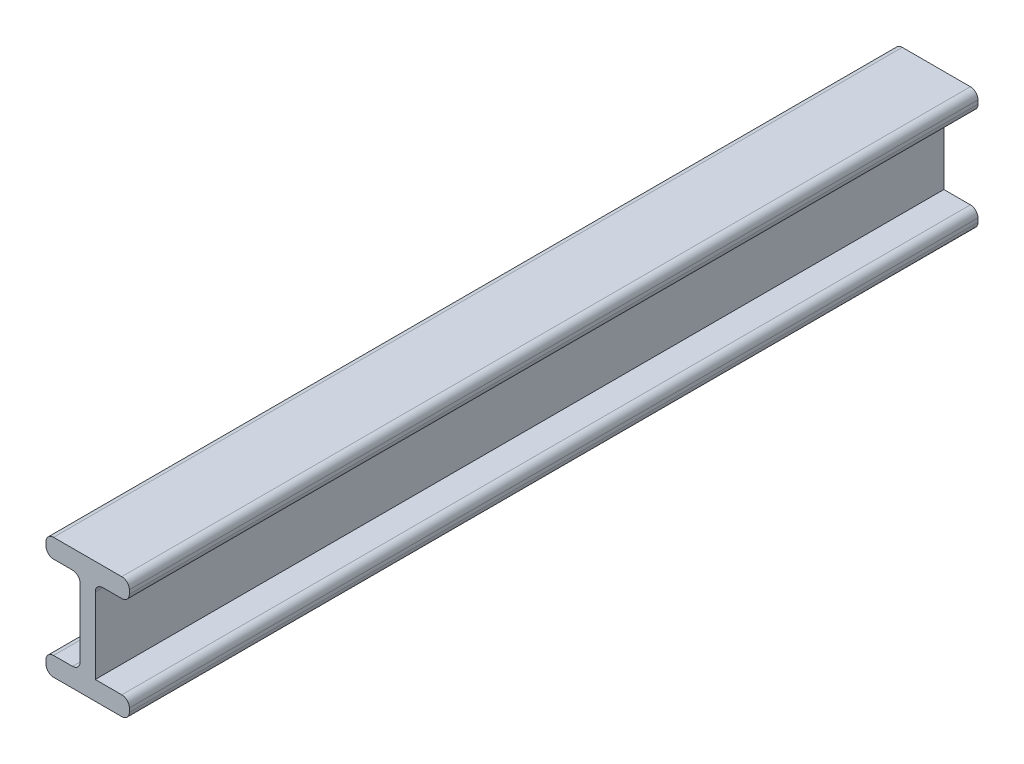
ISO-10303-21;
HEADER;
FILE_DESCRIPTION(('STEP AP214'),'2;1');
FILE_NAME('part.step','',(''),(''),'','','');
FILE_SCHEMA(('AUTOMOTIVE_DESIGN { 1 0 10303 214 1 1 1 1 }'));
ENDSEC;
DATA;
#1=APPLICATION_CONTEXT('core data for automotive mechanical design processes');
#2=APPLICATION_PROTOCOL_DEFINITION('international standard','automotive_design',2000,#1);
#3=PRODUCT_CONTEXT('',#1,'mechanical');
#4=PRODUCT('Part','Part','',(#3));
#5=PRODUCT_RELATED_PRODUCT_CATEGORY('part','',(#4));
#6=PRODUCT_DEFINITION_FORMATION('','',#4);
#7=PRODUCT_DEFINITION_CONTEXT('part definition',#1,'design');
#8=PRODUCT_DEFINITION('design','',#6,#7);
#9=PRODUCT_DEFINITION_SHAPE('','',#8);
#10=(LENGTH_UNIT() NAMED_UNIT(*) SI_UNIT(.MILLI.,.METRE.));
#11=(NAMED_UNIT(*) PLANE_ANGLE_UNIT() SI_UNIT($,.RADIAN.));
#12=(NAMED_UNIT(*) SI_UNIT($,.STERADIAN.) SOLID_ANGLE_UNIT());
#13=UNCERTAINTY_MEASURE_WITH_UNIT(LENGTH_MEASURE(1.E-05),#10,'distance_accuracy_value','');
#14=(GEOMETRIC_REPRESENTATION_CONTEXT(3) GLOBAL_UNCERTAINTY_ASSIGNED_CONTEXT((#13)) GLOBAL_UNIT_ASSIGNED_CONTEXT((#10,
#11,#12)) REPRESENTATION_CONTEXT('',''));
#15=CARTESIAN_POINT('',(0.,0.,0.));
#16=DIRECTION('',(0.,0.,1.));
#17=DIRECTION('',(1.,0.,0.));
#18=AXIS2_PLACEMENT_3D('',#15,#16,#17);
#19=CARTESIAN_POINT('',(20.,45.,1120.));
#20=DIRECTION('',(0.,0.,-1.));
#21=DIRECTION('',(-1.,0.,0.));
#22=AXIS2_PLACEMENT_3D('',#19,#20,#21);
#23=CYLINDRICAL_SURFACE('',#22,10.);
#24=CARTESIAN_POINT('',(20.,45.,0.));
#25=DIRECTION('',(0.,0.,-1.));
#26=DIRECTION('',(1.,0.,0.));
#27=AXIS2_PLACEMENT_3D('',#24,#25,#26);
#28=CIRCLE('',#27,10.);
#29=CARTESIAN_POINT('',(10.,45.,0.));
#30=VERTEX_POINT('',#29);
#31=CARTESIAN_POINT('',(20.,55.,0.));
#32=VERTEX_POINT('',#31);
#33=EDGE_CURVE('E242',#30,#32,#28,.T.);
#34=ORIENTED_EDGE('',*,*,#33,.T.);
#35=DIRECTION('',(0.,0.,-1.));
#36=VECTOR('',#35,1.);
#37=CARTESIAN_POINT('',(20.,55.,1120.));
#38=LINE('',#37,#36);
#39=CARTESIAN_POINT('',(20.,55.,1120.));
#40=VERTEX_POINT('',#39);
#41=EDGE_CURVE('E12',#40,#32,#38,.T.);
#42=ORIENTED_EDGE('',*,*,#41,.F.);
#43=CARTESIAN_POINT('',(20.,45.,1120.));
#44=DIRECTION('',(0.,0.,-1.));
#45=DIRECTION('',(1.,0.,0.));
#46=AXIS2_PLACEMENT_3D('',#43,#44,#45);
#47=CIRCLE('',#46,10.);
#48=CARTESIAN_POINT('',(10.,45.,1120.));
#49=VERTEX_POINT('',#48);
#50=EDGE_CURVE('E353',#49,#40,#47,.T.);
#51=ORIENTED_EDGE('',*,*,#50,.F.);
#52=DIRECTION('',(0.,0.,-1.));
#53=VECTOR('',#52,1.);
#54=CARTESIAN_POINT('',(10.,45.,1120.));
#55=LINE('',#54,#53);
#56=EDGE_CURVE('E237',#49,#30,#55,.T.);
#57=ORIENTED_EDGE('',*,*,#56,.T.);
#58=EDGE_LOOP('',(#34,#42,#51,#57));
#59=FACE_BOUND('',#58,.T.);
#60=ADVANCED_FACE('F50',(#59),#23,.F.);
#61=CARTESIAN_POINT('',(20.,55.,1120.));
#62=DIRECTION('',(0.,1.,0.));
#63=DIRECTION('',(-1.,0.,0.));
#64=AXIS2_PLACEMENT_3D('',#61,#62,#63);
#65=PLANE('',#64);
#66=DIRECTION('',(1.,0.,0.));
#67=VECTOR('',#66,1.);
#68=CARTESIAN_POINT('',(20.,55.,0.));
#69=LINE('',#68,#67);
#70=CARTESIAN_POINT('',(45.,55.,0.));
#71=VERTEX_POINT('',#70);
#72=EDGE_CURVE('E293',#32,#71,#69,.T.);
#73=ORIENTED_EDGE('',*,*,#72,.T.);
#74=DIRECTION('',(0.,0.,-1.));
#75=VECTOR('',#74,1.);
#76=CARTESIAN_POINT('',(45.,55.,1120.));
#77=LINE('',#76,#75);
#78=CARTESIAN_POINT('',(45.,55.,1120.));
#79=VERTEX_POINT('',#78);
#80=EDGE_CURVE('E59',#79,#71,#77,.T.);
#81=ORIENTED_EDGE('',*,*,#80,.F.);
#82=DIRECTION('',(1.,0.,0.));
#83=VECTOR('',#82,1.);
#84=CARTESIAN_POINT('',(20.,55.,1120.));
#85=LINE('',#84,#83);
#86=EDGE_CURVE('E155',#40,#79,#85,.T.);
#87=ORIENTED_EDGE('',*,*,#86,.F.);
#88=ORIENTED_EDGE('',*,*,#41,.T.);
#89=EDGE_LOOP('',(#73,#81,#87,#88));
#90=FACE_BOUND('',#89,.T.);
#91=ADVANCED_FACE('F515',(#90),#65,.F.);
#92=CARTESIAN_POINT('',(45.,65.,1120.));
#93=DIRECTION('',(0.,0.,-1.));
#94=DIRECTION('',(-1.,0.,0.));
#95=AXIS2_PLACEMENT_3D('',#92,#93,#94);
#96=CYLINDRICAL_SURFACE('',#95,10.);
#97=CARTESIAN_POINT('',(45.,65.,0.));
#98=DIRECTION('',(0.,0.,1.));
#99=DIRECTION('',(1.,0.,0.));
#100=AXIS2_PLACEMENT_3D('',#97,#98,#99);
#101=CIRCLE('',#100,10.);
#102=CARTESIAN_POINT('',(55.,65.,0.));
#103=VERTEX_POINT('',#102);
#104=EDGE_CURVE('E287',#71,#103,#101,.T.);
#105=ORIENTED_EDGE('',*,*,#104,.T.);
#106=DIRECTION('',(0.,0.,-1.));
#107=VECTOR('',#106,1.);
#108=CARTESIAN_POINT('',(55.,65.,1120.));
#109=LINE('',#108,#107);
#110=CARTESIAN_POINT('',(55.,65.,1120.));
#111=VERTEX_POINT('',#110);
#112=EDGE_CURVE('E276',#111,#103,#109,.T.);
#113=ORIENTED_EDGE('',*,*,#112,.F.);
#114=CARTESIAN_POINT('',(45.,65.,1120.));
#115=DIRECTION('',(0.,0.,1.));
#116=DIRECTION('',(1.,0.,0.));
#117=AXIS2_PLACEMENT_3D('',#114,#115,#116);
#118=CIRCLE('',#117,10.);
#119=EDGE_CURVE('E288',#79,#111,#118,.T.);
#120=ORIENTED_EDGE('',*,*,#119,.F.);
#121=ORIENTED_EDGE('',*,*,#80,.T.);
#122=EDGE_LOOP('',(#105,#113,#120,#121));
#123=FACE_BOUND('',#122,.T.);
#124=ADVANCED_FACE('F285',(#123),#96,.T.);
#125=CARTESIAN_POINT('',(55.,69.9999999999999,1120.));
#126=DIRECTION('',(-1.,0.,0.));
#127=DIRECTION('',(0.,-1.,0.));
#128=AXIS2_PLACEMENT_3D('',#125,#126,#127);
#129=PLANE('',#128);
#130=DIRECTION('',(0.,1.,0.));
#131=VECTOR('',#130,1.);
#132=CARTESIAN_POINT('',(55.,69.9999999999999,0.));
#133=LINE('',#132,#131);
#134=CARTESIAN_POINT('',(55.,69.9999999999999,0.));
#135=VERTEX_POINT('',#134);
#136=EDGE_CURVE('E295',#103,#135,#133,.T.);
#137=ORIENTED_EDGE('',*,*,#136,.T.);
#138=DIRECTION('',(0.,0.,-1.));
#139=VECTOR('',#138,1.);
#140=CARTESIAN_POINT('',(55.,69.9999999999999,1120.));
#141=LINE('',#140,#139);
#142=CARTESIAN_POINT('',(55.,69.9999999999999,1120.));
#143=VERTEX_POINT('',#142);
#144=EDGE_CURVE('E269',#143,#135,#141,.T.);
#145=ORIENTED_EDGE('',*,*,#144,.F.);
#146=DIRECTION('',(0.,1.,0.));
#147=VECTOR('',#146,1.);
#148=CARTESIAN_POINT('',(55.,69.9999999999999,1120.));
#149=LINE('',#148,#147);
#150=EDGE_CURVE('E363',#111,#143,#149,.T.);
#151=ORIENTED_EDGE('',*,*,#150,.F.);
#152=ORIENTED_EDGE('',*,*,#112,.T.);
#153=EDGE_LOOP('',(#137,#145,#151,#152));
#154=FACE_BOUND('',#153,.T.);
#155=ADVANCED_FACE('F507',(#154),#129,.F.);
#156=CARTESIAN_POINT('',(45.,69.9999999999999,1120.));
#157=DIRECTION('',(0.,0.,-1.));
#158=DIRECTION('',(-1.,0.,0.));
#159=AXIS2_PLACEMENT_3D('',#156,#157,#158);
#160=CYLINDRICAL_SURFACE('',#159,10.0000000000001);
#161=CARTESIAN_POINT('',(45.,69.9999999999999,0.));
#162=DIRECTION('',(0.,0.,1.));
#163=DIRECTION('',(-1.,0.,0.));
#164=AXIS2_PLACEMENT_3D('',#161,#162,#163);
#165=CIRCLE('',#164,10.0000000000001);
#166=CARTESIAN_POINT('',(45.,80.,0.));
#167=VERTEX_POINT('',#166);
#168=EDGE_CURVE('E300',#135,#167,#165,.T.);
#169=ORIENTED_EDGE('',*,*,#168,.T.);
#170=DIRECTION('',(0.,0.,-1.));
#171=VECTOR('',#170,1.);
#172=CARTESIAN_POINT('',(45.,80.,1120.));
#173=LINE('',#172,#171);
#174=CARTESIAN_POINT('',(45.,80.,1120.));
#175=VERTEX_POINT('',#174);
#176=EDGE_CURVE('E264',#175,#167,#173,.T.);
#177=ORIENTED_EDGE('',*,*,#176,.F.);
#178=CARTESIAN_POINT('',(45.,69.9999999999999,1120.));
#179=DIRECTION('',(0.,0.,1.));
#180=DIRECTION('',(-1.,0.,0.));
#181=AXIS2_PLACEMENT_3D('',#178,#179,#180);
#182=CIRCLE('',#181,10.0000000000001);
#183=EDGE_CURVE('E366',#143,#175,#182,.T.);
#184=ORIENTED_EDGE('',*,*,#183,.F.);
#185=ORIENTED_EDGE('',*,*,#144,.T.);
#186=EDGE_LOOP('',(#169,#177,#184,#185));
#187=FACE_BOUND('',#186,.T.);
#188=ADVANCED_FACE('F503',(#187),#160,.T.);
#189=CARTESIAN_POINT('',(-45.,80.0000000000001,1120.));
#190=DIRECTION('',(0.,-1.,0.));
#191=DIRECTION('',(0.,0.,-1.));
#192=AXIS2_PLACEMENT_3D('',#189,#190,#191);
#193=PLANE('',#192);
#194=DIRECTION('',(-1.,0.,0.));
#195=VECTOR('',#194,1.);
#196=CARTESIAN_POINT('',(-45.,80.0000000000001,0.));
#197=LINE('',#196,#195);
#198=CARTESIAN_POINT('',(-45.,80.0000000000001,0.));
#199=VERTEX_POINT('',#198);
#200=EDGE_CURVE('E305',#167,#199,#197,.T.);
#201=ORIENTED_EDGE('',*,*,#200,.T.);
#202=DIRECTION('',(0.,0.,-1.));
#203=VECTOR('',#202,1.);
#204=CARTESIAN_POINT('',(-45.,80.0000000000001,1120.));
#205=LINE('',#204,#203);
#206=CARTESIAN_POINT('',(-45.,80.0000000000001,1120.));
#207=VERTEX_POINT('',#206);
#208=EDGE_CURVE('E270',#207,#199,#205,.T.);
#209=ORIENTED_EDGE('',*,*,#208,.F.);
#210=DIRECTION('',(-1.,0.,0.));
#211=VECTOR('',#210,1.);
#212=CARTESIAN_POINT('',(-45.,80.0000000000001,1120.));
#213=LINE('',#212,#211);
#214=EDGE_CURVE('E369',#175,#207,#213,.T.);
#215=ORIENTED_EDGE('',*,*,#214,.F.);
#216=ORIENTED_EDGE('',*,*,#176,.T.);
#217=EDGE_LOOP('',(#201,#209,#215,#216));
#218=FACE_BOUND('',#217,.T.);
#219=ADVANCED_FACE('F501',(#218),#193,.F.);
#220=CARTESIAN_POINT('',(-45.,70.,1120.));
#221=DIRECTION('',(0.,0.,-1.));
#222=DIRECTION('',(-1.,0.,0.));
#223=AXIS2_PLACEMENT_3D('',#220,#221,#222);
#224=CYLINDRICAL_SURFACE('',#223,10.);
#225=CARTESIAN_POINT('',(-45.,70.,0.));
#226=DIRECTION('',(0.,0.,1.));
#227=DIRECTION('',(-1.,0.,0.));
#228=AXIS2_PLACEMENT_3D('',#225,#226,#227);
#229=CIRCLE('',#228,10.);
#230=CARTESIAN_POINT('',(-55.,70.,0.));
#231=VERTEX_POINT('',#230);
#232=EDGE_CURVE('E308',#199,#231,#229,.T.);
#233=ORIENTED_EDGE('',*,*,#232,.T.);
#234=DIRECTION('',(0.,0.,-1.));
#235=VECTOR('',#234,1.);
#236=CARTESIAN_POINT('',(-55.,70.,1120.));
#237=LINE('',#236,#235);
#238=CARTESIAN_POINT('',(-55.,70.,1120.));
#239=VERTEX_POINT('',#238);
#240=EDGE_CURVE('E472',#239,#231,#237,.T.);
#241=ORIENTED_EDGE('',*,*,#240,.F.);
#242=CARTESIAN_POINT('',(-45.,70.,1120.));
#243=DIRECTION('',(0.,0.,1.));
#244=DIRECTION('',(-1.,0.,0.));
#245=AXIS2_PLACEMENT_3D('',#242,#243,#244);
#246=CIRCLE('',#245,10.);
#247=EDGE_CURVE('E372',#207,#239,#246,.T.);
#248=ORIENTED_EDGE('',*,*,#247,.F.);
#249=ORIENTED_EDGE('',*,*,#208,.T.);
#250=EDGE_LOOP('',(#233,#241,#248,#249));
#251=FACE_BOUND('',#250,.T.);
#252=ADVANCED_FACE('F485',(#251),#224,.T.);
#253=CARTESIAN_POINT('',(-55.,70.,1120.));
#254=DIRECTION('',(1.,0.,0.));
#255=DIRECTION('',(0.,0.,-1.));
#256=AXIS2_PLACEMENT_3D('',#253,#254,#255);
#257=PLANE('',#256);
#258=DIRECTION('',(0.,-1.,0.));
#259=VECTOR('',#258,1.);
#260=CARTESIAN_POINT('',(-55.,70.,0.));
#261=LINE('',#260,#259);
#262=CARTESIAN_POINT('',(-55.,65.,0.));
#263=VERTEX_POINT('',#262);
#264=EDGE_CURVE('E311',#231,#263,#261,.T.);
#265=ORIENTED_EDGE('',*,*,#264,.T.);
#266=DIRECTION('',(0.,0.,-1.));
#267=VECTOR('',#266,1.);
#268=CARTESIAN_POINT('',(-55.,65.,1120.));
#269=LINE('',#268,#267);
#270=CARTESIAN_POINT('',(-55.,65.,1120.));
#271=VERTEX_POINT('',#270);
#272=EDGE_CURVE('E469',#271,#263,#269,.T.);
#273=ORIENTED_EDGE('',*,*,#272,.F.);
#274=DIRECTION('',(0.,-1.,0.));
#275=VECTOR('',#274,1.);
#276=CARTESIAN_POINT('',(-55.,70.,1120.));
#277=LINE('',#276,#275);
#278=EDGE_CURVE('E375',#239,#271,#277,.T.);
#279=ORIENTED_EDGE('',*,*,#278,.F.);
#280=ORIENTED_EDGE('',*,*,#240,.T.);
#281=EDGE_LOOP('',(#265,#273,#279,#280));
#282=FACE_BOUND('',#281,.T.);
#283=ADVANCED_FACE('F492',(#282),#257,.F.);
#284=CARTESIAN_POINT('',(-45.,65.,1120.));
#285=DIRECTION('',(0.,0.,-1.));
#286=DIRECTION('',(-1.,0.,0.));
#287=AXIS2_PLACEMENT_3D('',#284,#285,#286);
#288=CYLINDRICAL_SURFACE('',#287,10.);
#289=CARTESIAN_POINT('',(-45.,65.,0.));
#290=DIRECTION('',(0.,0.,1.));
#291=DIRECTION('',(1.,0.,0.));
#292=AXIS2_PLACEMENT_3D('',#289,#290,#291);
#293=CIRCLE('',#292,10.);
#294=CARTESIAN_POINT('',(-45.,55.,0.));
#295=VERTEX_POINT('',#294);
#296=EDGE_CURVE('E314',#263,#295,#293,.T.);
#297=ORIENTED_EDGE('',*,*,#296,.T.);
#298=DIRECTION('',(0.,0.,-1.));
#299=VECTOR('',#298,1.);
#300=CARTESIAN_POINT('',(-45.,55.,1120.));
#301=LINE('',#300,#299);
#302=CARTESIAN_POINT('',(-45.,55.,1120.));
#303=VERTEX_POINT('',#302);
#304=EDGE_CURVE('E465',#303,#295,#301,.T.);
#305=ORIENTED_EDGE('',*,*,#304,.F.);
#306=CARTESIAN_POINT('',(-45.,65.,1120.));
#307=DIRECTION('',(0.,0.,1.));
#308=DIRECTION('',(1.,0.,0.));
#309=AXIS2_PLACEMENT_3D('',#306,#307,#308);
#310=CIRCLE('',#309,10.);
#311=EDGE_CURVE('E378',#271,#303,#310,.T.);
#312=ORIENTED_EDGE('',*,*,#311,.F.);
#313=ORIENTED_EDGE('',*,*,#272,.T.);
#314=EDGE_LOOP('',(#297,#305,#312,#313));
#315=FACE_BOUND('',#314,.T.);
#316=ADVANCED_FACE('F495',(#315),#288,.T.);
#317=CARTESIAN_POINT('',(-45.,55.,1120.));
#318=DIRECTION('',(0.,1.,0.));
#319=DIRECTION('',(-1.,0.,0.));
#320=AXIS2_PLACEMENT_3D('',#317,#318,#319);
#321=PLANE('',#320);
#322=DIRECTION('',(1.,0.,0.));
#323=VECTOR('',#322,1.);
#324=CARTESIAN_POINT('',(-45.,55.,0.));
#325=LINE('',#324,#323);
#326=CARTESIAN_POINT('',(-20.,55.,0.));
#327=VERTEX_POINT('',#326);
#328=EDGE_CURVE('E317',#295,#327,#325,.T.);
#329=ORIENTED_EDGE('',*,*,#328,.T.);
#330=DIRECTION('',(0.,0.,-1.));
#331=VECTOR('',#330,1.);
#332=CARTESIAN_POINT('',(-20.,55.,1120.));
#333=LINE('',#332,#331);
#334=CARTESIAN_POINT('',(-20.,55.,1120.));
#335=VERTEX_POINT('',#334);
#336=EDGE_CURVE('E461',#335,#327,#333,.T.);
#337=ORIENTED_EDGE('',*,*,#336,.F.);
#338=DIRECTION('',(1.,0.,0.));
#339=VECTOR('',#338,1.);
#340=CARTESIAN_POINT('',(-45.,55.,1120.));
#341=LINE('',#340,#339);
#342=EDGE_CURVE('E381',#303,#335,#341,.T.);
#343=ORIENTED_EDGE('',*,*,#342,.F.);
#344=ORIENTED_EDGE('',*,*,#304,.T.);
#345=EDGE_LOOP('',(#329,#337,#343,#344));
#346=FACE_BOUND('',#345,.T.);
#347=ADVANCED_FACE('F563',(#346),#321,.F.);
#348=CARTESIAN_POINT('',(-20.,45.,1120.));
#349=DIRECTION('',(0.,0.,-1.));
#350=DIRECTION('',(-1.,0.,0.));
#351=AXIS2_PLACEMENT_3D('',#348,#349,#350);
#352=CYLINDRICAL_SURFACE('',#351,10.);
#353=CARTESIAN_POINT('',(-20.,45.,0.));
#354=DIRECTION('',(0.,0.,-1.));
#355=DIRECTION('',(1.,0.,0.));
#356=AXIS2_PLACEMENT_3D('',#353,#354,#355);
#357=CIRCLE('',#356,10.);
#358=CARTESIAN_POINT('',(-10.,45.,0.));
#359=VERTEX_POINT('',#358);
#360=EDGE_CURVE('E320',#327,#359,#357,.T.);
#361=ORIENTED_EDGE('',*,*,#360,.T.);
#362=DIRECTION('',(0.,0.,-1.));
#363=VECTOR('',#362,1.);
#364=CARTESIAN_POINT('',(-10.,45.,1120.));
#365=LINE('',#364,#363);
#366=CARTESIAN_POINT('',(-10.,45.,1120.));
#367=VERTEX_POINT('',#366);
#368=EDGE_CURVE('E457',#367,#359,#365,.T.);
#369=ORIENTED_EDGE('',*,*,#368,.F.);
#370=CARTESIAN_POINT('',(-20.,45.,1120.));
#371=DIRECTION('',(0.,0.,-1.));
#372=DIRECTION('',(1.,0.,0.));
#373=AXIS2_PLACEMENT_3D('',#370,#371,#372);
#374=CIRCLE('',#373,10.);
#375=EDGE_CURVE('E384',#335,#367,#374,.T.);
#376=ORIENTED_EDGE('',*,*,#375,.F.);
#377=ORIENTED_EDGE('',*,*,#336,.T.);
#378=EDGE_LOOP('',(#361,#369,#376,#377));
#379=FACE_BOUND('',#378,.T.);
#380=ADVANCED_FACE('F561',(#379),#352,.F.);
#381=CARTESIAN_POINT('',(-10.,45.,1120.));
#382=DIRECTION('',(1.,0.,0.));
#383=DIRECTION('',(0.,0.,-1.));
#384=AXIS2_PLACEMENT_3D('',#381,#382,#383);
#385=PLANE('',#384);
#386=DIRECTION('',(0.,-1.,0.));
#387=VECTOR('',#386,1.);
#388=CARTESIAN_POINT('',(-10.,45.,0.));
#389=LINE('',#388,#387);
#390=CARTESIAN_POINT('',(-10.,-45.,0.));
#391=VERTEX_POINT('',#390);
#392=EDGE_CURVE('E323',#359,#391,#389,.T.);
#393=ORIENTED_EDGE('',*,*,#392,.T.);
#394=DIRECTION('',(0.,0.,-1.));
#395=VECTOR('',#394,1.);
#396=CARTESIAN_POINT('',(-10.,-45.,1120.));
#397=LINE('',#396,#395);
#398=CARTESIAN_POINT('',(-10.,-45.,1120.));
#399=VERTEX_POINT('',#398);
#400=EDGE_CURVE('E453',#399,#391,#397,.T.);
#401=ORIENTED_EDGE('',*,*,#400,.F.);
#402=DIRECTION('',(0.,-1.,0.));
#403=VECTOR('',#402,1.);
#404=CARTESIAN_POINT('',(-10.,45.,1120.));
#405=LINE('',#404,#403);
#406=EDGE_CURVE('E388',#367,#399,#405,.T.);
#407=ORIENTED_EDGE('',*,*,#406,.F.);
#408=ORIENTED_EDGE('',*,*,#368,.T.);
#409=EDGE_LOOP('',(#393,#401,#407,#408));
#410=FACE_BOUND('',#409,.T.);
#411=ADVANCED_FACE('F556',(#410),#385,.F.);
#412=CARTESIAN_POINT('',(-20.,-45.,1120.));
#413=DIRECTION('',(0.,0.,-1.));
#414=DIRECTION('',(-1.,0.,0.));
#415=AXIS2_PLACEMENT_3D('',#412,#413,#414);
#416=CYLINDRICAL_SURFACE('',#415,10.);
#417=CARTESIAN_POINT('',(-20.,-45.,0.));
#418=DIRECTION('',(0.,0.,-1.));
#419=DIRECTION('',(-1.,0.,0.));
#420=AXIS2_PLACEMENT_3D('',#417,#418,#419);
#421=CIRCLE('',#420,10.);
#422=CARTESIAN_POINT('',(-20.,-55.,0.));
#423=VERTEX_POINT('',#422);
#424=EDGE_CURVE('E326',#391,#423,#421,.T.);
#425=ORIENTED_EDGE('',*,*,#424,.T.);
#426=DIRECTION('',(0.,0.,-1.));
#427=VECTOR('',#426,1.);
#428=CARTESIAN_POINT('',(-20.,-55.,1120.));
#429=LINE('',#428,#427);
#430=CARTESIAN_POINT('',(-20.,-55.,1120.));
#431=VERTEX_POINT('',#430);
#432=EDGE_CURVE('E449',#431,#423,#429,.T.);
#433=ORIENTED_EDGE('',*,*,#432,.F.);
#434=CARTESIAN_POINT('',(-20.,-45.,1120.));
#435=DIRECTION('',(0.,0.,-1.));
#436=DIRECTION('',(-1.,0.,0.));
#437=AXIS2_PLACEMENT_3D('',#434,#435,#436);
#438=CIRCLE('',#437,10.);
#439=EDGE_CURVE('E391',#399,#431,#438,.T.);
#440=ORIENTED_EDGE('',*,*,#439,.F.);
#441=ORIENTED_EDGE('',*,*,#400,.T.);
#442=EDGE_LOOP('',(#425,#433,#440,#441));
#443=FACE_BOUND('',#442,.T.);
#444=ADVANCED_FACE('F551',(#443),#416,.F.);
#445=CARTESIAN_POINT('',(-45.,-55.,1120.));
#446=DIRECTION('',(0.,-1.,0.));
#447=DIRECTION('',(1.,0.,0.));
#448=AXIS2_PLACEMENT_3D('',#445,#446,#447);
#449=PLANE('',#448);
#450=DIRECTION('',(-1.,0.,0.));
#451=VECTOR('',#450,1.);
#452=CARTESIAN_POINT('',(-45.,-55.,0.));
#453=LINE('',#452,#451);
#454=CARTESIAN_POINT('',(-45.,-55.,0.));
#455=VERTEX_POINT('',#454);
#456=EDGE_CURVE('E329',#423,#455,#453,.T.);
#457=ORIENTED_EDGE('',*,*,#456,.T.);
#458=DIRECTION('',(0.,0.,-1.));
#459=VECTOR('',#458,1.);
#460=CARTESIAN_POINT('',(-45.,-55.,1120.));
#461=LINE('',#460,#459);
#462=CARTESIAN_POINT('',(-45.,-55.,1120.));
#463=VERTEX_POINT('',#462);
#464=EDGE_CURVE('E445',#463,#455,#461,.T.);
#465=ORIENTED_EDGE('',*,*,#464,.F.);
#466=DIRECTION('',(-1.,0.,0.));
#467=VECTOR('',#466,1.);
#468=CARTESIAN_POINT('',(-45.,-55.,1120.));
#469=LINE('',#468,#467);
#470=EDGE_CURVE('E394',#431,#463,#469,.T.);
#471=ORIENTED_EDGE('',*,*,#470,.F.);
#472=ORIENTED_EDGE('',*,*,#432,.T.);
#473=EDGE_LOOP('',(#457,#465,#471,#472));
#474=FACE_BOUND('',#473,.T.);
#475=ADVANCED_FACE('F547',(#474),#449,.F.);
#476=CARTESIAN_POINT('',(-45.,-65.,1120.));
#477=DIRECTION('',(0.,0.,-1.));
#478=DIRECTION('',(-1.,0.,0.));
#479=AXIS2_PLACEMENT_3D('',#476,#477,#478);
#480=CYLINDRICAL_SURFACE('',#479,10.);
#481=CARTESIAN_POINT('',(-45.,-65.,0.));
#482=DIRECTION('',(0.,0.,1.));
#483=DIRECTION('',(-1.,0.,0.));
#484=AXIS2_PLACEMENT_3D('',#481,#482,#483);
#485=CIRCLE('',#484,10.);
#486=CARTESIAN_POINT('',(-55.,-65.,0.));
#487=VERTEX_POINT('',#486);
#488=EDGE_CURVE('E332',#455,#487,#485,.T.);
#489=ORIENTED_EDGE('',*,*,#488,.T.);
#490=DIRECTION('',(0.,0.,-1.));
#491=VECTOR('',#490,1.);
#492=CARTESIAN_POINT('',(-55.,-65.,1120.));
#493=LINE('',#492,#491);
#494=CARTESIAN_POINT('',(-55.,-65.,1120.));
#495=VERTEX_POINT('',#494);
#496=EDGE_CURVE('E441',#495,#487,#493,.T.);
#497=ORIENTED_EDGE('',*,*,#496,.F.);
#498=CARTESIAN_POINT('',(-45.,-65.,1120.));
#499=DIRECTION('',(0.,0.,1.));
#500=DIRECTION('',(-1.,0.,0.));
#501=AXIS2_PLACEMENT_3D('',#498,#499,#500);
#502=CIRCLE('',#501,10.);
#503=EDGE_CURVE('E397',#463,#495,#502,.T.);
#504=ORIENTED_EDGE('',*,*,#503,.F.);
#505=ORIENTED_EDGE('',*,*,#464,.T.);
#506=EDGE_LOOP('',(#489,#497,#504,#505));
#507=FACE_BOUND('',#506,.T.);
#508=ADVANCED_FACE('F542',(#507),#480,.T.);
#509=CARTESIAN_POINT('',(-55.,-70.,1120.));
#510=DIRECTION('',(1.,0.,0.));
#511=DIRECTION('',(0.,0.,-1.));
#512=AXIS2_PLACEMENT_3D('',#509,#510,#511);
#513=PLANE('',#512);
#514=DIRECTION('',(0.,-1.,0.));
#515=VECTOR('',#514,1.);
#516=CARTESIAN_POINT('',(-55.,-70.,0.));
#517=LINE('',#516,#515);
#518=CARTESIAN_POINT('',(-55.,-70.,0.));
#519=VERTEX_POINT('',#518);
#520=EDGE_CURVE('E335',#487,#519,#517,.T.);
#521=ORIENTED_EDGE('',*,*,#520,.T.);
#522=DIRECTION('',(0.,0.,-1.));
#523=VECTOR('',#522,1.);
#524=CARTESIAN_POINT('',(-55.,-70.,1120.));
#525=LINE('',#524,#523);
#526=CARTESIAN_POINT('',(-55.,-70.,1120.));
#527=VERTEX_POINT('',#526);
#528=EDGE_CURVE('E437',#527,#519,#525,.T.);
#529=ORIENTED_EDGE('',*,*,#528,.F.);
#530=DIRECTION('',(0.,-1.,0.));
#531=VECTOR('',#530,1.);
#532=CARTESIAN_POINT('',(-55.,-70.,1120.));
#533=LINE('',#532,#531);
#534=EDGE_CURVE('E400',#495,#527,#533,.T.);
#535=ORIENTED_EDGE('',*,*,#534,.F.);
#536=ORIENTED_EDGE('',*,*,#496,.T.);
#537=EDGE_LOOP('',(#521,#529,#535,#536));
#538=FACE_BOUND('',#537,.T.);
#539=ADVANCED_FACE('F536',(#538),#513,.F.);
#540=CARTESIAN_POINT('',(-45.,-70.,1120.));
#541=DIRECTION('',(0.,0.,-1.));
#542=DIRECTION('',(-1.,0.,0.));
#543=AXIS2_PLACEMENT_3D('',#540,#541,#542);
#544=CYLINDRICAL_SURFACE('',#543,10.);
#545=CARTESIAN_POINT('',(-45.,-70.,0.));
#546=DIRECTION('',(0.,0.,1.));
#547=DIRECTION('',(1.,0.,0.));
#548=AXIS2_PLACEMENT_3D('',#545,#546,#547);
#549=CIRCLE('',#548,10.);
#550=CARTESIAN_POINT('',(-45.,-80.,0.));
#551=VERTEX_POINT('',#550);
#552=EDGE_CURVE('E338',#519,#551,#549,.T.);
#553=ORIENTED_EDGE('',*,*,#552,.T.);
#554=DIRECTION('',(0.,0.,-1.));
#555=VECTOR('',#554,1.);
#556=CARTESIAN_POINT('',(-45.,-80.,1120.));
#557=LINE('',#556,#555);
#558=CARTESIAN_POINT('',(-45.,-80.,1120.));
#559=VERTEX_POINT('',#558);
#560=EDGE_CURVE('E433',#559,#551,#557,.T.);
#561=ORIENTED_EDGE('',*,*,#560,.F.);
#562=CARTESIAN_POINT('',(-45.,-70.,1120.));
#563=DIRECTION('',(0.,0.,1.));
#564=DIRECTION('',(1.,0.,0.));
#565=AXIS2_PLACEMENT_3D('',#562,#563,#564);
#566=CIRCLE('',#565,10.);
#567=EDGE_CURVE('E403',#527,#559,#566,.T.);
#568=ORIENTED_EDGE('',*,*,#567,.F.);
#569=ORIENTED_EDGE('',*,*,#528,.T.);
#570=EDGE_LOOP('',(#553,#561,#568,#569));
#571=FACE_BOUND('',#570,.T.);
#572=ADVANCED_FACE('F532',(#571),#544,.T.);
#573=CARTESIAN_POINT('',(-45.,-80.0000000000001,1120.));
#574=DIRECTION('',(0.,1.,0.));
#575=DIRECTION('',(0.,0.,1.));
#576=AXIS2_PLACEMENT_3D('',#573,#574,#575);
#577=PLANE('',#576);
#578=DIRECTION('',(1.,0.,0.));
#579=VECTOR('',#578,1.);
#580=CARTESIAN_POINT('',(-45.,-80.0000000000001,0.));
#581=LINE('',#580,#579);
#582=CARTESIAN_POINT('',(45.,-80.0000000000001,0.));
#583=VERTEX_POINT('',#582);
#584=EDGE_CURVE('E341',#551,#583,#581,.T.);
#585=ORIENTED_EDGE('',*,*,#584,.T.);
#586=DIRECTION('',(0.,0.,-1.));
#587=VECTOR('',#586,1.);
#588=CARTESIAN_POINT('',(45.,-80.0000000000001,1120.));
#589=LINE('',#588,#587);
#590=CARTESIAN_POINT('',(45.,-80.0000000000001,1120.));
#591=VERTEX_POINT('',#590);
#592=EDGE_CURVE('E425',#591,#583,#589,.T.);
#593=ORIENTED_EDGE('',*,*,#592,.F.);
#594=DIRECTION('',(1.,0.,0.));
#595=VECTOR('',#594,1.);
#596=CARTESIAN_POINT('',(-45.,-80.0000000000001,1120.));
#597=LINE('',#596,#595);
#598=EDGE_CURVE('E406',#559,#591,#597,.T.);
#599=ORIENTED_EDGE('',*,*,#598,.F.);
#600=ORIENTED_EDGE('',*,*,#560,.T.);
#601=EDGE_LOOP('',(#585,#593,#599,#600));
#602=FACE_BOUND('',#601,.T.);
#603=ADVANCED_FACE('F528',(#602),#577,.F.);
#604=CARTESIAN_POINT('',(45.,-69.9999999999999,1120.));
#605=DIRECTION('',(0.,0.,-1.));
#606=DIRECTION('',(-1.,0.,0.));
#607=AXIS2_PLACEMENT_3D('',#604,#605,#606);
#608=CYLINDRICAL_SURFACE('',#607,10.0000000000001);
#609=CARTESIAN_POINT('',(45.,-69.9999999999999,0.));
#610=DIRECTION('',(0.,0.,1.));
#611=DIRECTION('',(-1.,0.,0.));
#612=AXIS2_PLACEMENT_3D('',#609,#610,#611);
#613=CIRCLE('',#612,10.0000000000001);
#614=CARTESIAN_POINT('',(55.0000000000001,-69.9999999999999,0.));
#615=VERTEX_POINT('',#614);
#616=EDGE_CURVE('E344',#583,#615,#613,.T.);
#617=ORIENTED_EDGE('',*,*,#616,.T.);
#618=DIRECTION('',(0.,0.,-1.));
#619=VECTOR('',#618,1.);
#620=CARTESIAN_POINT('',(55.0000000000001,-69.9999999999999,1120.));
#621=LINE('',#620,#619);
#622=CARTESIAN_POINT('',(55.0000000000001,-69.9999999999999,1120.));
#623=VERTEX_POINT('',#622);
#624=EDGE_CURVE('E419',#623,#615,#621,.T.);
#625=ORIENTED_EDGE('',*,*,#624,.F.);
#626=CARTESIAN_POINT('',(45.,-69.9999999999999,1120.));
#627=DIRECTION('',(0.,0.,1.));
#628=DIRECTION('',(-1.,0.,0.));
#629=AXIS2_PLACEMENT_3D('',#626,#627,#628);
#630=CIRCLE('',#629,10.0000000000001);
#631=EDGE_CURVE('E409',#591,#623,#630,.T.);
#632=ORIENTED_EDGE('',*,*,#631,.F.);
#633=ORIENTED_EDGE('',*,*,#592,.T.);
#634=EDGE_LOOP('',(#617,#625,#632,#633));
#635=FACE_BOUND('',#634,.T.);
#636=ADVANCED_FACE('F420',(#635),#608,.T.);
#637=CARTESIAN_POINT('',(55.,-69.9999999999999,1120.));
#638=DIRECTION('',(-1.,0.,0.));
#639=DIRECTION('',(0.,-1.,0.));
#640=AXIS2_PLACEMENT_3D('',#637,#638,#639);
#641=PLANE('',#640);
#642=DIRECTION('',(0.,1.,0.));
#643=VECTOR('',#642,1.);
#644=CARTESIAN_POINT('',(55.,-69.9999999999999,0.));
#645=LINE('',#644,#643);
#646=CARTESIAN_POINT('',(55.,-65.,0.));
#647=VERTEX_POINT('',#646);
#648=EDGE_CURVE('E347',#615,#647,#645,.T.);
#649=ORIENTED_EDGE('',*,*,#648,.T.);
#650=DIRECTION('',(0.,0.,-1.));
#651=VECTOR('',#650,1.);
#652=CARTESIAN_POINT('',(55.,-65.,1120.));
#653=LINE('',#652,#651);
#654=CARTESIAN_POINT('',(55.,-65.,1120.));
#655=VERTEX_POINT('',#654);
#656=EDGE_CURVE('E230',#655,#647,#653,.T.);
#657=ORIENTED_EDGE('',*,*,#656,.F.);
#658=DIRECTION('',(0.,1.,0.));
#659=VECTOR('',#658,1.);
#660=CARTESIAN_POINT('',(55.,-69.9999999999999,1120.));
#661=LINE('',#660,#659);
#662=EDGE_CURVE('E219',#623,#655,#661,.T.);
#663=ORIENTED_EDGE('',*,*,#662,.F.);
#664=ORIENTED_EDGE('',*,*,#624,.T.);
#665=EDGE_LOOP('',(#649,#657,#663,#664));
#666=FACE_BOUND('',#665,.T.);
#667=ADVANCED_FACE('F427',(#666),#641,.F.);
#668=CARTESIAN_POINT('',(45.,-65.,1120.));
#669=DIRECTION('',(0.,0.,-1.));
#670=DIRECTION('',(-1.,0.,0.));
#671=AXIS2_PLACEMENT_3D('',#668,#669,#670);
#672=CYLINDRICAL_SURFACE('',#671,10.);
#673=CARTESIAN_POINT('',(45.,-65.,0.));
#674=DIRECTION('',(0.,0.,1.));
#675=DIRECTION('',(1.,0.,0.));
#676=AXIS2_PLACEMENT_3D('',#673,#674,#675);
#677=CIRCLE('',#676,10.);
#678=CARTESIAN_POINT('',(45.,-55.,0.));
#679=VERTEX_POINT('',#678);
#680=EDGE_CURVE('E228',#647,#679,#677,.T.);
#681=ORIENTED_EDGE('',*,*,#680,.T.);
#682=DIRECTION('',(0.,0.,-1.));
#683=VECTOR('',#682,1.);
#684=CARTESIAN_POINT('',(45.,-55.,1120.));
#685=LINE('',#684,#683);
#686=CARTESIAN_POINT('',(45.,-55.,1120.));
#687=VERTEX_POINT('',#686);
#688=EDGE_CURVE('E225',#687,#679,#685,.T.);
#689=ORIENTED_EDGE('',*,*,#688,.F.);
#690=CARTESIAN_POINT('',(45.,-65.,1120.));
#691=DIRECTION('',(0.,0.,1.));
#692=DIRECTION('',(1.,0.,0.));
#693=AXIS2_PLACEMENT_3D('',#690,#691,#692);
#694=CIRCLE('',#693,10.);
#695=EDGE_CURVE('E213',#655,#687,#694,.T.);
#696=ORIENTED_EDGE('',*,*,#695,.F.);
#697=ORIENTED_EDGE('',*,*,#656,.T.);
#698=EDGE_LOOP('',(#681,#689,#696,#697));
#699=FACE_BOUND('',#698,.T.);
#700=ADVANCED_FACE('F226',(#699),#672,.T.);
#701=CARTESIAN_POINT('',(10.,-55.,1120.));
#702=DIRECTION('',(0.,-1.,0.));
#703=DIRECTION('',(0.,0.,-1.));
#704=AXIS2_PLACEMENT_3D('',#701,#702,#703);
#705=PLANE('',#704);
#706=DIRECTION('',(-1.,0.,0.));
#707=VECTOR('',#706,1.);
#708=CARTESIAN_POINT('',(10.,-55.,0.));
#709=LINE('',#708,#707);
#710=CARTESIAN_POINT('',(10.,-55.,0.));
#711=VERTEX_POINT('',#710);
#712=EDGE_CURVE('E141',#679,#711,#709,.T.);
#713=ORIENTED_EDGE('',*,*,#712,.T.);
#714=DIRECTION('',(0.,0.,-1.));
#715=VECTOR('',#714,1.);
#716=CARTESIAN_POINT('',(10.,-55.,1120.));
#717=LINE('',#716,#715);
#718=CARTESIAN_POINT('',(10.,-55.,1120.));
#719=VERTEX_POINT('',#718);
#720=EDGE_CURVE('E231',#719,#711,#717,.T.);
#721=ORIENTED_EDGE('',*,*,#720,.F.);
#722=DIRECTION('',(-1.,0.,0.));
#723=VECTOR('',#722,1.);
#724=CARTESIAN_POINT('',(10.,-55.,1120.));
#725=LINE('',#724,#723);
#726=EDGE_CURVE('E217',#687,#719,#725,.T.);
#727=ORIENTED_EDGE('',*,*,#726,.F.);
#728=ORIENTED_EDGE('',*,*,#688,.T.);
#729=EDGE_LOOP('',(#713,#721,#727,#728));
#730=FACE_BOUND('',#729,.T.);
#731=ADVANCED_FACE('F233',(#730),#705,.F.);
#732=CARTESIAN_POINT('',(10.,45.,1120.));
#733=DIRECTION('',(-1.,0.,0.));
#734=DIRECTION('',(0.,0.,1.));
#735=AXIS2_PLACEMENT_3D('',#732,#733,#734);
#736=PLANE('',#735);
#737=DIRECTION('',(0.,1.,0.));
#738=VECTOR('',#737,1.);
#739=CARTESIAN_POINT('',(10.,45.,0.));
#740=LINE('',#739,#738);
#741=EDGE_CURVE('E147',#711,#30,#740,.T.);
#742=ORIENTED_EDGE('',*,*,#741,.T.);
#743=ORIENTED_EDGE('',*,*,#56,.F.);
#744=DIRECTION('',(0.,1.,0.));
#745=VECTOR('',#744,1.);
#746=CARTESIAN_POINT('',(10.,45.,1120.));
#747=LINE('',#746,#745);
#748=EDGE_CURVE('E67',#719,#49,#747,.T.);
#749=ORIENTED_EDGE('',*,*,#748,.F.);
#750=ORIENTED_EDGE('',*,*,#720,.T.);
#751=EDGE_LOOP('',(#742,#743,#749,#750));
#752=FACE_BOUND('',#751,.T.);
#753=ADVANCED_FACE('F584',(#752),#736,.F.);
#754=CARTESIAN_POINT('',(20.,45.,1120.));
#755=DIRECTION('',(0.,0.,1.));
#756=DIRECTION('',(1.,0.,0.));
#757=AXIS2_PLACEMENT_3D('',#754,#755,#756);
#758=PLANE('',#757);
#759=ORIENTED_EDGE('',*,*,#50,.T.);
#760=ORIENTED_EDGE('',*,*,#86,.T.);
#761=ORIENTED_EDGE('',*,*,#119,.T.);
#762=ORIENTED_EDGE('',*,*,#150,.T.);
#763=ORIENTED_EDGE('',*,*,#183,.T.);
#764=ORIENTED_EDGE('',*,*,#214,.T.);
#765=ORIENTED_EDGE('',*,*,#247,.T.);
#766=ORIENTED_EDGE('',*,*,#278,.T.);
#767=ORIENTED_EDGE('',*,*,#311,.T.);
#768=ORIENTED_EDGE('',*,*,#342,.T.);
#769=ORIENTED_EDGE('',*,*,#375,.T.);
#770=ORIENTED_EDGE('',*,*,#406,.T.);
#771=ORIENTED_EDGE('',*,*,#439,.T.);
#772=ORIENTED_EDGE('',*,*,#470,.T.);
#773=ORIENTED_EDGE('',*,*,#503,.T.);
#774=ORIENTED_EDGE('',*,*,#534,.T.);
#775=ORIENTED_EDGE('',*,*,#567,.T.);
#776=ORIENTED_EDGE('',*,*,#598,.T.);
#777=ORIENTED_EDGE('',*,*,#631,.T.);
#778=ORIENTED_EDGE('',*,*,#662,.T.);
#779=ORIENTED_EDGE('',*,*,#695,.T.);
#780=ORIENTED_EDGE('',*,*,#726,.T.);
#781=ORIENTED_EDGE('',*,*,#748,.T.);
#782=EDGE_LOOP('',(#759,#760,#761,#762,#763,#764,#765,#766,#767,#768,#769,#770,#771,#772,#773,
#774,#775,#776,#777,#778,#779,#780,#781));
#783=FACE_BOUND('',#782,.T.);
#784=ADVANCED_FACE('F215',(#783),#758,.T.);
#785=CARTESIAN_POINT('',(20.,45.,0.));
#786=DIRECTION('',(0.,0.,1.));
#787=DIRECTION('',(1.,0.,0.));
#788=AXIS2_PLACEMENT_3D('',#785,#786,#787);
#789=PLANE('',#788);
#790=ORIENTED_EDGE('',*,*,#33,.F.);
#791=ORIENTED_EDGE('',*,*,#741,.F.);
#792=ORIENTED_EDGE('',*,*,#712,.F.);
#793=ORIENTED_EDGE('',*,*,#680,.F.);
#794=ORIENTED_EDGE('',*,*,#648,.F.);
#795=ORIENTED_EDGE('',*,*,#616,.F.);
#796=ORIENTED_EDGE('',*,*,#584,.F.);
#797=ORIENTED_EDGE('',*,*,#552,.F.);
#798=ORIENTED_EDGE('',*,*,#520,.F.);
#799=ORIENTED_EDGE('',*,*,#488,.F.);
#800=ORIENTED_EDGE('',*,*,#456,.F.);
#801=ORIENTED_EDGE('',*,*,#424,.F.);
#802=ORIENTED_EDGE('',*,*,#392,.F.);
#803=ORIENTED_EDGE('',*,*,#360,.F.);
#804=ORIENTED_EDGE('',*,*,#328,.F.);
#805=ORIENTED_EDGE('',*,*,#296,.F.);
#806=ORIENTED_EDGE('',*,*,#264,.F.);
#807=ORIENTED_EDGE('',*,*,#232,.F.);
#808=ORIENTED_EDGE('',*,*,#200,.F.);
#809=ORIENTED_EDGE('',*,*,#168,.F.);
#810=ORIENTED_EDGE('',*,*,#136,.F.);
#811=ORIENTED_EDGE('',*,*,#104,.F.);
#812=ORIENTED_EDGE('',*,*,#72,.F.);
#813=EDGE_LOOP('',(#790,#791,#792,#793,#794,#795,#796,#797,#798,#799,#800,#801,#802,#803,#804,
#805,#806,#807,#808,#809,#810,#811,#812));
#814=FACE_BOUND('',#813,.T.);
#815=ADVANCED_FACE('F292',(#814),#789,.F.);
#816=CLOSED_SHELL('',(#60,#91,#124,#155,#188,#219,#252,#283,#316,#347,#380,#411,#444,#475,#508,
#539,#572,#603,#636,#667,#700,#731,#753,#784,#815));
#817=MANIFOLD_SOLID_BREP('B2',#816);
#818=ADVANCED_BREP_SHAPE_REPRESENTATION('',(#18,#817),#14);
#819=SHAPE_DEFINITION_REPRESENTATION(#9,#818);
ENDSEC;
END-ISO-10303-21;
